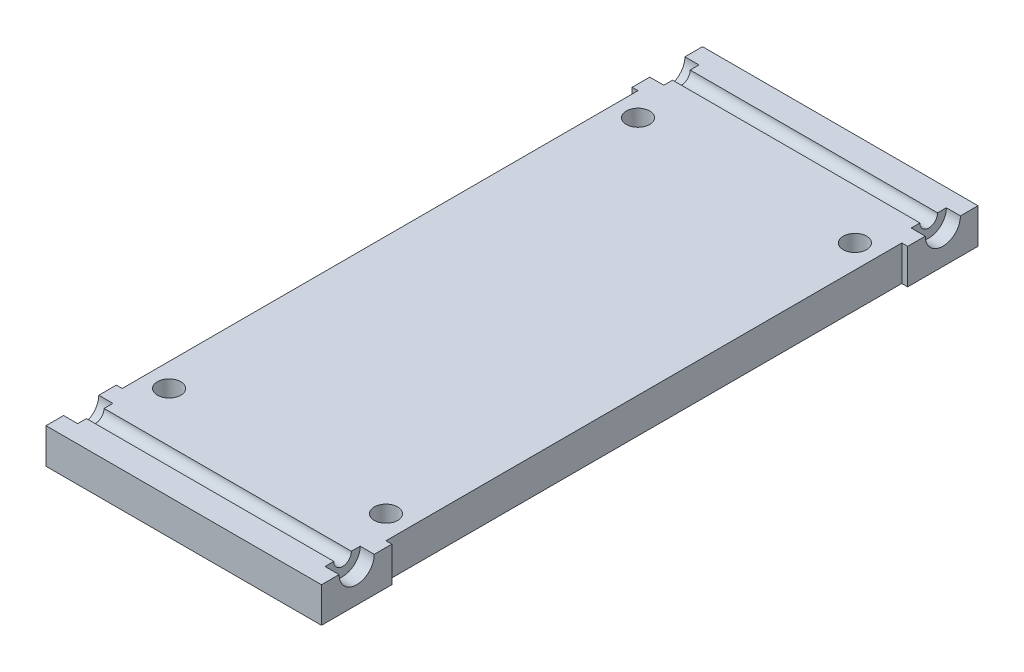
ISO-10303-21;
HEADER;
FILE_DESCRIPTION(('STEP AP214'),'2;1');
FILE_NAME('part.step','',(''),(''),'','','');
FILE_SCHEMA(('AUTOMOTIVE_DESIGN { 1 0 10303 214 1 1 1 1 }'));
ENDSEC;
DATA;
#1=APPLICATION_CONTEXT('core data for automotive mechanical design processes');
#2=APPLICATION_PROTOCOL_DEFINITION('international standard','automotive_design',2000,#1);
#3=PRODUCT_CONTEXT('',#1,'mechanical');
#4=PRODUCT('Part','Part','',(#3));
#5=PRODUCT_RELATED_PRODUCT_CATEGORY('part','',(#4));
#6=PRODUCT_DEFINITION_FORMATION('','',#4);
#7=PRODUCT_DEFINITION_CONTEXT('part definition',#1,'design');
#8=PRODUCT_DEFINITION('design','',#6,#7);
#9=PRODUCT_DEFINITION_SHAPE('','',#8);
#10=(LENGTH_UNIT() NAMED_UNIT(*) SI_UNIT(.MILLI.,.METRE.));
#11=(NAMED_UNIT(*) PLANE_ANGLE_UNIT() SI_UNIT($,.RADIAN.));
#12=(NAMED_UNIT(*) SI_UNIT($,.STERADIAN.) SOLID_ANGLE_UNIT());
#13=UNCERTAINTY_MEASURE_WITH_UNIT(LENGTH_MEASURE(1.E-05),#10,'distance_accuracy_value','');
#14=(GEOMETRIC_REPRESENTATION_CONTEXT(3) GLOBAL_UNCERTAINTY_ASSIGNED_CONTEXT((#13)) GLOBAL_UNIT_ASSIGNED_CONTEXT((#10,
#11,#12)) REPRESENTATION_CONTEXT('',''));
#15=CARTESIAN_POINT('',(0.,0.,0.));
#16=DIRECTION('',(0.,0.,1.));
#17=DIRECTION('',(1.,0.,0.));
#18=AXIS2_PLACEMENT_3D('',#15,#16,#17);
#19=CARTESIAN_POINT('',(0.,3.,0.));
#20=DIRECTION('',(0.,-1.,0.));
#21=DIRECTION('',(0.,0.,-1.));
#22=AXIS2_PLACEMENT_3D('',#19,#20,#21);
#23=PLANE('',#22);
#24=CARTESIAN_POINT('',(-9.25000000000001,3.,-20.));
#25=DIRECTION('',(0.,-1.,0.));
#26=DIRECTION('',(0.,0.,-1.));
#27=AXIS2_PLACEMENT_3D('',#24,#25,#26);
#28=CIRCLE('',#27,1.);
#29=CARTESIAN_POINT('',(-9.25000000000001,3.,-21.));
#30=VERTEX_POINT('',#29);
#31=EDGE_CURVE('E265',#30,#30,#28,.T.);
#32=ORIENTED_EDGE('',*,*,#31,.T.);
#33=EDGE_LOOP('',(#32));
#34=FACE_BOUND('',#33,.T.);
#35=CARTESIAN_POINT('',(9.25000000000001,3.,20.));
#36=DIRECTION('',(0.,-1.,0.));
#37=DIRECTION('',(0.,0.,-1.));
#38=AXIS2_PLACEMENT_3D('',#35,#36,#37);
#39=CIRCLE('',#38,1.);
#40=CARTESIAN_POINT('',(9.25000000000001,3.,19.));
#41=VERTEX_POINT('',#40);
#42=EDGE_CURVE('E251',#41,#41,#39,.T.);
#43=ORIENTED_EDGE('',*,*,#42,.T.);
#44=EDGE_LOOP('',(#43));
#45=FACE_BOUND('',#44,.T.);
#46=CARTESIAN_POINT('',(9.25000000000001,3.,-20.));
#47=DIRECTION('',(0.,-1.,0.));
#48=DIRECTION('',(0.,0.,-1.));
#49=AXIS2_PLACEMENT_3D('',#46,#47,#48);
#50=CIRCLE('',#49,1.);
#51=CARTESIAN_POINT('',(9.25000000000001,3.,-21.));
#52=VERTEX_POINT('',#51);
#53=EDGE_CURVE('E261',#52,#52,#50,.T.);
#54=ORIENTED_EDGE('',*,*,#53,.T.);
#55=EDGE_LOOP('',(#54));
#56=FACE_BOUND('',#55,.T.);
#57=CARTESIAN_POINT('',(-9.25000000000001,3.,20.));
#58=DIRECTION('',(0.,-1.,0.));
#59=DIRECTION('',(0.,0.,-1.));
#60=AXIS2_PLACEMENT_3D('',#57,#58,#59);
#61=CIRCLE('',#60,1.);
#62=CARTESIAN_POINT('',(-9.25000000000001,3.,19.));
#63=VERTEX_POINT('',#62);
#64=EDGE_CURVE('E262',#63,#63,#61,.T.);
#65=ORIENTED_EDGE('',*,*,#64,.T.);
#66=EDGE_LOOP('',(#65));
#67=FACE_BOUND('',#66,.T.);
#68=DIRECTION('',(1.,0.,0.));
#69=VECTOR('',#68,1.);
#70=CARTESIAN_POINT('',(11.25,3.,-22.));
#71=LINE('',#70,#69);
#72=CARTESIAN_POINT('',(11.25,3.,-22.));
#73=VERTEX_POINT('',#72);
#74=CARTESIAN_POINT('',(11.75,3.,-22.));
#75=VERTEX_POINT('',#74);
#76=EDGE_CURVE('E213',#73,#75,#71,.T.);
#77=ORIENTED_EDGE('',*,*,#76,.T.);
#78=DIRECTION('',(0.,0.,-1.));
#79=VECTOR('',#78,1.);
#80=CARTESIAN_POINT('',(11.75,3.,28.));
#81=LINE('',#80,#79);
#82=CARTESIAN_POINT('',(11.75,3.,-23.5));
#83=VERTEX_POINT('',#82);
#84=EDGE_CURVE('E369',#75,#83,#81,.T.);
#85=ORIENTED_EDGE('',*,*,#84,.T.);
#86=DIRECTION('',(1.,0.,0.));
#87=VECTOR('',#86,1.);
#88=CARTESIAN_POINT('',(10.55,3.,-23.5));
#89=LINE('',#88,#87);
#90=CARTESIAN_POINT('',(10.55,3.,-23.5));
#91=VERTEX_POINT('',#90);
#92=EDGE_CURVE('E360',#83,#91,#89,.F.);
#93=ORIENTED_EDGE('',*,*,#92,.T.);
#94=DIRECTION('',(0.,0.,1.));
#95=VECTOR('',#94,1.);
#96=CARTESIAN_POINT('',(10.55,3.,0.));
#97=LINE('',#96,#95);
#98=CARTESIAN_POINT('',(10.55,3.,-24.25));
#99=VERTEX_POINT('',#98);
#100=EDGE_CURVE('E352',#99,#91,#97,.T.);
#101=ORIENTED_EDGE('',*,*,#100,.F.);
#102=DIRECTION('',(1.,0.,0.));
#103=VECTOR('',#102,1.);
#104=CARTESIAN_POINT('',(-11.75,3.,-24.25));
#105=LINE('',#104,#103);
#106=CARTESIAN_POINT('',(-10.55,3.,-24.25));
#107=VERTEX_POINT('',#106);
#108=EDGE_CURVE('E403',#99,#107,#105,.F.);
#109=ORIENTED_EDGE('',*,*,#108,.T.);
#110=DIRECTION('',(0.,0.,1.));
#111=VECTOR('',#110,1.);
#112=CARTESIAN_POINT('',(-10.55,3.,0.));
#113=LINE('',#112,#111);
#114=CARTESIAN_POINT('',(-10.55,3.,-23.5));
#115=VERTEX_POINT('',#114);
#116=EDGE_CURVE('E331',#107,#115,#113,.T.);
#117=ORIENTED_EDGE('',*,*,#116,.T.);
#118=DIRECTION('',(-1.,0.,0.));
#119=VECTOR('',#118,1.);
#120=CARTESIAN_POINT('',(-10.55,3.,-23.5));
#121=LINE('',#120,#119);
#122=CARTESIAN_POINT('',(-11.75,3.,-23.5));
#123=VERTEX_POINT('',#122);
#124=EDGE_CURVE('E326',#123,#115,#121,.F.);
#125=ORIENTED_EDGE('',*,*,#124,.F.);
#126=DIRECTION('',(0.,0.,1.));
#127=VECTOR('',#126,1.);
#128=CARTESIAN_POINT('',(-11.75,3.,28.));
#129=LINE('',#128,#127);
#130=CARTESIAN_POINT('',(-11.75,3.,-22.));
#131=VERTEX_POINT('',#130);
#132=EDGE_CURVE('E376',#123,#131,#129,.T.);
#133=ORIENTED_EDGE('',*,*,#132,.T.);
#134=DIRECTION('',(-1.,0.,0.));
#135=VECTOR('',#134,1.);
#136=CARTESIAN_POINT('',(-11.25,3.,-22.));
#137=LINE('',#136,#135);
#138=CARTESIAN_POINT('',(-11.25,3.,-22.));
#139=VERTEX_POINT('',#138);
#140=EDGE_CURVE('E249',#139,#131,#137,.T.);
#141=ORIENTED_EDGE('',*,*,#140,.F.);
#142=DIRECTION('',(0.,0.,-1.));
#143=VECTOR('',#142,1.);
#144=CARTESIAN_POINT('',(-11.25,3.,-22.));
#145=LINE('',#144,#143);
#146=CARTESIAN_POINT('',(-11.25,3.,22.));
#147=VERTEX_POINT('',#146);
#148=EDGE_CURVE('E244',#147,#139,#145,.T.);
#149=ORIENTED_EDGE('',*,*,#148,.F.);
#150=DIRECTION('',(-1.,0.,0.));
#151=VECTOR('',#150,1.);
#152=CARTESIAN_POINT('',(-11.25,3.,22.));
#153=LINE('',#152,#151);
#154=CARTESIAN_POINT('',(-11.75,3.,22.));
#155=VERTEX_POINT('',#154);
#156=EDGE_CURVE('E252',#147,#155,#153,.T.);
#157=ORIENTED_EDGE('',*,*,#156,.T.);
#158=CARTESIAN_POINT('',(-11.75,3.,23.5));
#159=VERTEX_POINT('',#158);
#160=EDGE_CURVE('E377',#155,#159,#129,.T.);
#161=ORIENTED_EDGE('',*,*,#160,.T.);
#162=DIRECTION('',(-1.,0.,0.));
#163=VECTOR('',#162,1.);
#164=CARTESIAN_POINT('',(-10.55,3.,23.5));
#165=LINE('',#164,#163);
#166=CARTESIAN_POINT('',(-10.55,3.,23.5));
#167=VERTEX_POINT('',#166);
#168=EDGE_CURVE('E321',#167,#159,#165,.T.);
#169=ORIENTED_EDGE('',*,*,#168,.F.);
#170=DIRECTION('',(0.,0.,1.));
#171=VECTOR('',#170,1.);
#172=CARTESIAN_POINT('',(-10.55,3.,0.));
#173=LINE('',#172,#171);
#174=CARTESIAN_POINT('',(-10.55,3.,24.25));
#175=VERTEX_POINT('',#174);
#176=EDGE_CURVE('E318',#167,#175,#173,.T.);
#177=ORIENTED_EDGE('',*,*,#176,.T.);
#178=DIRECTION('',(1.,0.,0.));
#179=VECTOR('',#178,1.);
#180=CARTESIAN_POINT('',(-11.75,3.,24.25));
#181=LINE('',#180,#179);
#182=CARTESIAN_POINT('',(10.55,3.,24.25));
#183=VERTEX_POINT('',#182);
#184=EDGE_CURVE('E411',#175,#183,#181,.T.);
#185=ORIENTED_EDGE('',*,*,#184,.T.);
#186=DIRECTION('',(0.,0.,1.));
#187=VECTOR('',#186,1.);
#188=CARTESIAN_POINT('',(10.55,3.,0.));
#189=LINE('',#188,#187);
#190=CARTESIAN_POINT('',(10.55,3.,23.5));
#191=VERTEX_POINT('',#190);
#192=EDGE_CURVE('E346',#191,#183,#189,.T.);
#193=ORIENTED_EDGE('',*,*,#192,.F.);
#194=DIRECTION('',(1.,0.,0.));
#195=VECTOR('',#194,1.);
#196=CARTESIAN_POINT('',(10.55,3.,23.5));
#197=LINE('',#196,#195);
#198=CARTESIAN_POINT('',(11.75,3.,23.5));
#199=VERTEX_POINT('',#198);
#200=EDGE_CURVE('E354',#191,#199,#197,.T.);
#201=ORIENTED_EDGE('',*,*,#200,.T.);
#202=CARTESIAN_POINT('',(11.75,3.,22.));
#203=VERTEX_POINT('',#202);
#204=EDGE_CURVE('E368',#199,#203,#81,.T.);
#205=ORIENTED_EDGE('',*,*,#204,.T.);
#206=DIRECTION('',(1.,0.,0.));
#207=VECTOR('',#206,1.);
#208=CARTESIAN_POINT('',(11.25,3.,22.));
#209=LINE('',#208,#207);
#210=CARTESIAN_POINT('',(11.25,3.,22.));
#211=VERTEX_POINT('',#210);
#212=EDGE_CURVE('E223',#211,#203,#209,.T.);
#213=ORIENTED_EDGE('',*,*,#212,.F.);
#214=DIRECTION('',(0.,0.,-1.));
#215=VECTOR('',#214,1.);
#216=CARTESIAN_POINT('',(11.25,3.,28.));
#217=LINE('',#216,#215);
#218=EDGE_CURVE('E205',#211,#73,#217,.T.);
#219=ORIENTED_EDGE('',*,*,#218,.T.);
#220=EDGE_LOOP('',(#77,#85,#93,#101,#109,#117,#125,#133,#141,#149,#157,#161,#169,#177,#185,#193,
#201,#205,#213,#219));
#221=FACE_BOUND('',#220,.T.);
#222=ADVANCED_FACE('F41',(#34,#45,#56,#67,#221),#23,.F.);
#223=CARTESIAN_POINT('',(11.75,3.,28.));
#224=DIRECTION('',(-1.,0.,0.));
#225=DIRECTION('',(0.,0.,1.));
#226=AXIS2_PLACEMENT_3D('',#223,#224,#225);
#227=PLANE('',#226);
#228=DIRECTION('',(0.,-1.,0.));
#229=VECTOR('',#228,1.);
#230=CARTESIAN_POINT('',(11.75,3.,-22.));
#231=LINE('',#230,#229);
#232=CARTESIAN_POINT('',(11.75,0.,-22.));
#233=VERTEX_POINT('',#232);
#234=EDGE_CURVE('E216',#75,#233,#231,.T.);
#235=ORIENTED_EDGE('',*,*,#234,.T.);
#236=DIRECTION('',(0.,0.,-1.));
#237=VECTOR('',#236,1.);
#238=CARTESIAN_POINT('',(11.75,0.,28.));
#239=LINE('',#238,#237);
#240=CARTESIAN_POINT('',(11.75,0.,-28.));
#241=VERTEX_POINT('',#240);
#242=EDGE_CURVE('E363',#233,#241,#239,.T.);
#243=ORIENTED_EDGE('',*,*,#242,.T.);
#244=DIRECTION('',(0.,-1.,0.));
#245=VECTOR('',#244,1.);
#246=CARTESIAN_POINT('',(11.75,3.,-28.));
#247=LINE('',#246,#245);
#248=CARTESIAN_POINT('',(11.75,3.,-28.));
#249=VERTEX_POINT('',#248);
#250=EDGE_CURVE('E400',#249,#241,#247,.T.);
#251=ORIENTED_EDGE('',*,*,#250,.F.);
#252=CARTESIAN_POINT('',(11.75,3.,-26.5));
#253=VERTEX_POINT('',#252);
#254=EDGE_CURVE('E391',#253,#249,#81,.T.);
#255=ORIENTED_EDGE('',*,*,#254,.F.);
#256=CARTESIAN_POINT('',(11.75,3.,-25.));
#257=DIRECTION('',(1.,0.,0.));
#258=DIRECTION('',(0.,0.,-1.));
#259=AXIS2_PLACEMENT_3D('',#256,#257,#258);
#260=CIRCLE('',#259,1.5);
#261=EDGE_CURVE('E339',#83,#253,#260,.T.);
#262=ORIENTED_EDGE('',*,*,#261,.F.);
#263=ORIENTED_EDGE('',*,*,#84,.F.);
#264=EDGE_LOOP('',(#235,#243,#251,#255,#262,#263));
#265=FACE_BOUND('',#264,.T.);
#266=ADVANCED_FACE('F43',(#265),#227,.F.);
#267=DIRECTION('',(0.,1.,0.));
#268=VECTOR('',#267,1.);
#269=CARTESIAN_POINT('',(11.75,3.,22.));
#270=LINE('',#269,#268);
#271=CARTESIAN_POINT('',(11.75,0.,22.));
#272=VERTEX_POINT('',#271);
#273=EDGE_CURVE('E224',#272,#203,#270,.T.);
#274=ORIENTED_EDGE('',*,*,#273,.T.);
#275=ORIENTED_EDGE('',*,*,#204,.F.);
#276=CARTESIAN_POINT('',(11.75,3.,25.));
#277=DIRECTION('',(1.,0.,0.));
#278=DIRECTION('',(0.,0.,-1.));
#279=AXIS2_PLACEMENT_3D('',#276,#277,#278);
#280=CIRCLE('',#279,1.5);
#281=CARTESIAN_POINT('',(11.75,3.,26.5));
#282=VERTEX_POINT('',#281);
#283=EDGE_CURVE('E341',#282,#199,#280,.T.);
#284=ORIENTED_EDGE('',*,*,#283,.F.);
#285=CARTESIAN_POINT('',(11.75,3.,28.));
#286=VERTEX_POINT('',#285);
#287=EDGE_CURVE('E364',#286,#282,#81,.T.);
#288=ORIENTED_EDGE('',*,*,#287,.F.);
#289=DIRECTION('',(0.,-1.,0.));
#290=VECTOR('',#289,1.);
#291=CARTESIAN_POINT('',(11.75,3.,28.));
#292=LINE('',#291,#290);
#293=CARTESIAN_POINT('',(11.75,0.,28.));
#294=VERTEX_POINT('',#293);
#295=EDGE_CURVE('E379',#286,#294,#292,.T.);
#296=ORIENTED_EDGE('',*,*,#295,.T.);
#297=EDGE_CURVE('E380',#294,#272,#239,.T.);
#298=ORIENTED_EDGE('',*,*,#297,.T.);
#299=EDGE_LOOP('',(#274,#275,#284,#288,#296,#298));
#300=FACE_BOUND('',#299,.T.);
#301=ADVANCED_FACE('F457',(#300),#227,.F.);
#302=CARTESIAN_POINT('',(0.,0.,0.));
#303=DIRECTION('',(0.,-1.,0.));
#304=DIRECTION('',(0.,0.,-1.));
#305=AXIS2_PLACEMENT_3D('',#302,#303,#304);
#306=PLANE('',#305);
#307=CARTESIAN_POINT('',(9.25000000000001,0.,-20.));
#308=DIRECTION('',(0.,-1.,0.));
#309=DIRECTION('',(0.,0.,-1.));
#310=AXIS2_PLACEMENT_3D('',#307,#308,#309);
#311=CIRCLE('',#310,1.5);
#312=CARTESIAN_POINT('',(9.25000000000001,0.,-21.5));
#313=VERTEX_POINT('',#312);
#314=EDGE_CURVE('E289',#313,#313,#311,.T.);
#315=ORIENTED_EDGE('',*,*,#314,.F.);
#316=EDGE_LOOP('',(#315));
#317=FACE_BOUND('',#316,.T.);
#318=CARTESIAN_POINT('',(-9.25000000000001,0.,20.));
#319=DIRECTION('',(0.,-1.,0.));
#320=DIRECTION('',(0.,0.,-1.));
#321=AXIS2_PLACEMENT_3D('',#318,#319,#320);
#322=CIRCLE('',#321,1.5);
#323=CARTESIAN_POINT('',(-9.25000000000001,0.,18.5));
#324=VERTEX_POINT('',#323);
#325=EDGE_CURVE('E296',#324,#324,#322,.T.);
#326=ORIENTED_EDGE('',*,*,#325,.F.);
#327=EDGE_LOOP('',(#326));
#328=FACE_BOUND('',#327,.T.);
#329=CARTESIAN_POINT('',(9.25000000000001,0.,20.));
#330=DIRECTION('',(0.,-1.,0.));
#331=DIRECTION('',(0.,0.,-1.));
#332=AXIS2_PLACEMENT_3D('',#329,#330,#331);
#333=CIRCLE('',#332,1.5);
#334=CARTESIAN_POINT('',(9.25000000000001,0.,18.5));
#335=VERTEX_POINT('',#334);
#336=EDGE_CURVE('E283',#335,#335,#333,.T.);
#337=ORIENTED_EDGE('',*,*,#336,.F.);
#338=EDGE_LOOP('',(#337));
#339=FACE_BOUND('',#338,.T.);
#340=CARTESIAN_POINT('',(-9.25000000000001,0.,-20.));
#341=DIRECTION('',(0.,-1.,0.));
#342=DIRECTION('',(0.,0.,-1.));
#343=AXIS2_PLACEMENT_3D('',#340,#341,#342);
#344=CIRCLE('',#343,1.5);
#345=CARTESIAN_POINT('',(-9.25000000000001,0.,-21.5));
#346=VERTEX_POINT('',#345);
#347=EDGE_CURVE('E292',#346,#346,#344,.T.);
#348=ORIENTED_EDGE('',*,*,#347,.F.);
#349=EDGE_LOOP('',(#348));
#350=FACE_BOUND('',#349,.T.);
#351=ORIENTED_EDGE('',*,*,#242,.F.);
#352=DIRECTION('',(1.,0.,0.));
#353=VECTOR('',#352,1.);
#354=CARTESIAN_POINT('',(11.25,0.,-22.));
#355=LINE('',#354,#353);
#356=CARTESIAN_POINT('',(11.25,0.,-22.));
#357=VERTEX_POINT('',#356);
#358=EDGE_CURVE('E220',#357,#233,#355,.T.);
#359=ORIENTED_EDGE('',*,*,#358,.F.);
#360=DIRECTION('',(0.,0.,1.));
#361=VECTOR('',#360,1.);
#362=CARTESIAN_POINT('',(11.25,0.,28.));
#363=LINE('',#362,#361);
#364=CARTESIAN_POINT('',(11.25,0.,22.));
#365=VERTEX_POINT('',#364);
#366=EDGE_CURVE('E208',#357,#365,#363,.T.);
#367=ORIENTED_EDGE('',*,*,#366,.T.);
#368=DIRECTION('',(1.,0.,0.));
#369=VECTOR('',#368,1.);
#370=CARTESIAN_POINT('',(11.25,0.,22.));
#371=LINE('',#370,#369);
#372=EDGE_CURVE('E233',#365,#272,#371,.T.);
#373=ORIENTED_EDGE('',*,*,#372,.T.);
#374=ORIENTED_EDGE('',*,*,#297,.F.);
#375=DIRECTION('',(1.,0.,0.));
#376=VECTOR('',#375,1.);
#377=CARTESIAN_POINT('',(-11.75,0.,28.));
#378=LINE('',#377,#376);
#379=CARTESIAN_POINT('',(-11.75,0.,28.));
#380=VERTEX_POINT('',#379);
#381=EDGE_CURVE('E389',#380,#294,#378,.T.);
#382=ORIENTED_EDGE('',*,*,#381,.F.);
#383=DIRECTION('',(0.,0.,1.));
#384=VECTOR('',#383,1.);
#385=CARTESIAN_POINT('',(-11.75,0.,28.));
#386=LINE('',#385,#384);
#387=CARTESIAN_POINT('',(-11.75,0.,22.));
#388=VERTEX_POINT('',#387);
#389=EDGE_CURVE('E385',#388,#380,#386,.T.);
#390=ORIENTED_EDGE('',*,*,#389,.F.);
#391=DIRECTION('',(-1.,0.,0.));
#392=VECTOR('',#391,1.);
#393=CARTESIAN_POINT('',(-11.25,0.,22.));
#394=LINE('',#393,#392);
#395=CARTESIAN_POINT('',(-11.25,0.,22.));
#396=VERTEX_POINT('',#395);
#397=EDGE_CURVE('E255',#396,#388,#394,.T.);
#398=ORIENTED_EDGE('',*,*,#397,.F.);
#399=DIRECTION('',(0.,0.,1.));
#400=VECTOR('',#399,1.);
#401=CARTESIAN_POINT('',(-11.25,0.,-22.));
#402=LINE('',#401,#400);
#403=CARTESIAN_POINT('',(-11.25,0.,-22.));
#404=VERTEX_POINT('',#403);
#405=EDGE_CURVE('E238',#404,#396,#402,.T.);
#406=ORIENTED_EDGE('',*,*,#405,.F.);
#407=DIRECTION('',(-1.,0.,0.));
#408=VECTOR('',#407,1.);
#409=CARTESIAN_POINT('',(-11.25,0.,-22.));
#410=LINE('',#409,#408);
#411=CARTESIAN_POINT('',(-11.75,0.,-22.));
#412=VERTEX_POINT('',#411);
#413=EDGE_CURVE('E246',#404,#412,#410,.T.);
#414=ORIENTED_EDGE('',*,*,#413,.T.);
#415=CARTESIAN_POINT('',(-11.75,0.,-28.));
#416=VERTEX_POINT('',#415);
#417=EDGE_CURVE('E386',#416,#412,#386,.T.);
#418=ORIENTED_EDGE('',*,*,#417,.F.);
#419=DIRECTION('',(-1.,0.,0.));
#420=VECTOR('',#419,1.);
#421=CARTESIAN_POINT('',(-11.75,0.,-28.));
#422=LINE('',#421,#420);
#423=EDGE_CURVE('E383',#241,#416,#422,.T.);
#424=ORIENTED_EDGE('',*,*,#423,.F.);
#425=EDGE_LOOP('',(#351,#359,#367,#373,#374,#382,#390,#398,#406,#414,#418,#424));
#426=FACE_BOUND('',#425,.T.);
#427=ADVANCED_FACE('F484',(#317,#328,#339,#350,#426),#306,.T.);
#428=CARTESIAN_POINT('',(-11.75,3.,28.));
#429=DIRECTION('',(1.,0.,0.));
#430=DIRECTION('',(0.,0.,-1.));
#431=AXIS2_PLACEMENT_3D('',#428,#429,#430);
#432=PLANE('',#431);
#433=ORIENTED_EDGE('',*,*,#417,.T.);
#434=DIRECTION('',(0.,-1.,0.));
#435=VECTOR('',#434,1.);
#436=CARTESIAN_POINT('',(-11.75,3.,-22.));
#437=LINE('',#436,#435);
#438=EDGE_CURVE('E219',#131,#412,#437,.T.);
#439=ORIENTED_EDGE('',*,*,#438,.F.);
#440=ORIENTED_EDGE('',*,*,#132,.F.);
#441=CARTESIAN_POINT('',(-11.75,3.,-25.));
#442=DIRECTION('',(1.,0.,0.));
#443=DIRECTION('',(0.,0.,-1.));
#444=AXIS2_PLACEMENT_3D('',#441,#442,#443);
#445=CIRCLE('',#444,1.5);
#446=CARTESIAN_POINT('',(-11.75,3.,-26.5));
#447=VERTEX_POINT('',#446);
#448=EDGE_CURVE('E49',#447,#123,#445,.F.);
#449=ORIENTED_EDGE('',*,*,#448,.F.);
#450=CARTESIAN_POINT('',(-11.75,3.,-28.));
#451=VERTEX_POINT('',#450);
#452=EDGE_CURVE('E372',#451,#447,#129,.T.);
#453=ORIENTED_EDGE('',*,*,#452,.F.);
#454=DIRECTION('',(0.,-1.,0.));
#455=VECTOR('',#454,1.);
#456=CARTESIAN_POINT('',(-11.75,3.,-28.));
#457=LINE('',#456,#455);
#458=EDGE_CURVE('E397',#451,#416,#457,.T.);
#459=ORIENTED_EDGE('',*,*,#458,.T.);
#460=EDGE_LOOP('',(#433,#439,#440,#449,#453,#459));
#461=FACE_BOUND('',#460,.T.);
#462=ADVANCED_FACE('F437',(#461),#432,.F.);
#463=DIRECTION('',(-1.,0.,0.));
#464=VECTOR('',#463,1.);
#465=CARTESIAN_POINT('',(-10.55,3.,-26.5));
#466=LINE('',#465,#464);
#467=CARTESIAN_POINT('',(-10.55,3.,-26.5));
#468=VERTEX_POINT('',#467);
#469=EDGE_CURVE('E324',#468,#447,#466,.T.);
#470=ORIENTED_EDGE('',*,*,#469,.F.);
#471=DIRECTION('',(0.,0.,1.));
#472=VECTOR('',#471,1.);
#473=CARTESIAN_POINT('',(-10.55,3.,0.));
#474=LINE('',#473,#472);
#475=CARTESIAN_POINT('',(-10.55,3.,-25.75));
#476=VERTEX_POINT('',#475);
#477=EDGE_CURVE('E12',#468,#476,#474,.T.);
#478=ORIENTED_EDGE('',*,*,#477,.T.);
#479=DIRECTION('',(1.,0.,0.));
#480=VECTOR('',#479,1.);
#481=CARTESIAN_POINT('',(-11.75,3.,-25.75));
#482=LINE('',#481,#480);
#483=CARTESIAN_POINT('',(10.55,3.,-25.75));
#484=VERTEX_POINT('',#483);
#485=EDGE_CURVE('E406',#476,#484,#482,.T.);
#486=ORIENTED_EDGE('',*,*,#485,.T.);
#487=DIRECTION('',(0.,0.,1.));
#488=VECTOR('',#487,1.);
#489=CARTESIAN_POINT('',(10.55,3.,0.));
#490=LINE('',#489,#488);
#491=CARTESIAN_POINT('',(10.55,3.,-26.5));
#492=VERTEX_POINT('',#491);
#493=EDGE_CURVE('E349',#492,#484,#490,.T.);
#494=ORIENTED_EDGE('',*,*,#493,.F.);
#495=DIRECTION('',(1.,0.,0.));
#496=VECTOR('',#495,1.);
#497=CARTESIAN_POINT('',(10.55,3.,-26.5));
#498=LINE('',#497,#496);
#499=EDGE_CURVE('E357',#492,#253,#498,.T.);
#500=ORIENTED_EDGE('',*,*,#499,.T.);
#501=ORIENTED_EDGE('',*,*,#254,.T.);
#502=DIRECTION('',(-1.,0.,0.));
#503=VECTOR('',#502,1.);
#504=CARTESIAN_POINT('',(-11.75,3.,-28.));
#505=LINE('',#504,#503);
#506=EDGE_CURVE('E367',#249,#451,#505,.T.);
#507=ORIENTED_EDGE('',*,*,#506,.T.);
#508=ORIENTED_EDGE('',*,*,#452,.T.);
#509=EDGE_LOOP('',(#470,#478,#486,#494,#500,#501,#507,#508));
#510=FACE_BOUND('',#509,.T.);
#511=ADVANCED_FACE('F489',(#510),#23,.F.);
#512=DIRECTION('',(-1.,0.,0.));
#513=VECTOR('',#512,1.);
#514=CARTESIAN_POINT('',(-10.55,3.,26.5));
#515=LINE('',#514,#513);
#516=CARTESIAN_POINT('',(-11.75,3.,26.5));
#517=VERTEX_POINT('',#516);
#518=CARTESIAN_POINT('',(-10.55,3.,26.5));
#519=VERTEX_POINT('',#518);
#520=EDGE_CURVE('E423',#517,#519,#515,.F.);
#521=ORIENTED_EDGE('',*,*,#520,.F.);
#522=CARTESIAN_POINT('',(-11.75,3.,28.));
#523=VERTEX_POINT('',#522);
#524=EDGE_CURVE('E371',#517,#523,#129,.T.);
#525=ORIENTED_EDGE('',*,*,#524,.T.);
#526=DIRECTION('',(1.,0.,0.));
#527=VECTOR('',#526,1.);
#528=CARTESIAN_POINT('',(-11.75,3.,28.));
#529=LINE('',#528,#527);
#530=EDGE_CURVE('E375',#523,#286,#529,.T.);
#531=ORIENTED_EDGE('',*,*,#530,.T.);
#532=ORIENTED_EDGE('',*,*,#287,.T.);
#533=DIRECTION('',(1.,0.,0.));
#534=VECTOR('',#533,1.);
#535=CARTESIAN_POINT('',(10.55,3.,26.5));
#536=LINE('',#535,#534);
#537=CARTESIAN_POINT('',(10.55,3.,26.5));
#538=VERTEX_POINT('',#537);
#539=EDGE_CURVE('E417',#282,#538,#536,.F.);
#540=ORIENTED_EDGE('',*,*,#539,.T.);
#541=DIRECTION('',(0.,0.,1.));
#542=VECTOR('',#541,1.);
#543=CARTESIAN_POINT('',(10.55,3.,0.));
#544=LINE('',#543,#542);
#545=CARTESIAN_POINT('',(10.55,3.,25.75));
#546=VERTEX_POINT('',#545);
#547=EDGE_CURVE('E338',#546,#538,#544,.T.);
#548=ORIENTED_EDGE('',*,*,#547,.F.);
#549=DIRECTION('',(1.,0.,0.));
#550=VECTOR('',#549,1.);
#551=CARTESIAN_POINT('',(-11.75,3.,25.75));
#552=LINE('',#551,#550);
#553=CARTESIAN_POINT('',(-10.55,3.,25.75));
#554=VERTEX_POINT('',#553);
#555=EDGE_CURVE('E408',#546,#554,#552,.F.);
#556=ORIENTED_EDGE('',*,*,#555,.T.);
#557=DIRECTION('',(0.,0.,1.));
#558=VECTOR('',#557,1.);
#559=CARTESIAN_POINT('',(-10.55,3.,0.));
#560=LINE('',#559,#558);
#561=EDGE_CURVE('E420',#554,#519,#560,.T.);
#562=ORIENTED_EDGE('',*,*,#561,.T.);
#563=EDGE_LOOP('',(#521,#525,#531,#532,#540,#548,#556,#562));
#564=FACE_BOUND('',#563,.T.);
#565=ADVANCED_FACE('F442',(#564),#23,.F.);
#566=CARTESIAN_POINT('',(-11.75,3.,-25.));
#567=DIRECTION('',(1.,0.,0.));
#568=DIRECTION('',(0.,0.,-1.));
#569=AXIS2_PLACEMENT_3D('',#566,#567,#568);
#570=CYLINDRICAL_SURFACE('',#569,0.750000000000002);
#571=ORIENTED_EDGE('',*,*,#485,.F.);
#572=CARTESIAN_POINT('',(-10.55,3.,-25.));
#573=DIRECTION('',(1.,0.,0.));
#574=DIRECTION('',(0.,0.,-1.));
#575=AXIS2_PLACEMENT_3D('',#572,#573,#574);
#576=CIRCLE('',#575,0.750000000000002);
#577=EDGE_CURVE('E328',#476,#107,#576,.F.);
#578=ORIENTED_EDGE('',*,*,#577,.T.);
#579=ORIENTED_EDGE('',*,*,#108,.F.);
#580=CARTESIAN_POINT('',(10.55,3.,-25.));
#581=DIRECTION('',(1.,0.,0.));
#582=DIRECTION('',(0.,0.,-1.));
#583=AXIS2_PLACEMENT_3D('',#580,#581,#582);
#584=CIRCLE('',#583,0.750000000000002);
#585=EDGE_CURVE('E415',#484,#99,#584,.F.);
#586=ORIENTED_EDGE('',*,*,#585,.F.);
#587=EDGE_LOOP('',(#571,#578,#579,#586));
#588=FACE_BOUND('',#587,.T.);
#589=ADVANCED_FACE('F503',(#588),#570,.F.);
#590=CARTESIAN_POINT('',(-11.75,3.,25.));
#591=DIRECTION('',(1.,0.,0.));
#592=DIRECTION('',(0.,0.,-1.));
#593=AXIS2_PLACEMENT_3D('',#590,#591,#592);
#594=CYLINDRICAL_SURFACE('',#593,0.750000000000002);
#595=ORIENTED_EDGE('',*,*,#184,.F.);
#596=CARTESIAN_POINT('',(-10.55,3.,25.));
#597=DIRECTION('',(1.,0.,0.));
#598=DIRECTION('',(0.,0.,-1.));
#599=AXIS2_PLACEMENT_3D('',#596,#597,#598);
#600=CIRCLE('',#599,0.750000000000002);
#601=EDGE_CURVE('E310',#175,#554,#600,.F.);
#602=ORIENTED_EDGE('',*,*,#601,.T.);
#603=ORIENTED_EDGE('',*,*,#555,.F.);
#604=CARTESIAN_POINT('',(10.55,3.,25.));
#605=DIRECTION('',(1.,0.,0.));
#606=DIRECTION('',(0.,0.,-1.));
#607=AXIS2_PLACEMENT_3D('',#604,#605,#606);
#608=CIRCLE('',#607,0.750000000000002);
#609=EDGE_CURVE('E413',#183,#546,#608,.F.);
#610=ORIENTED_EDGE('',*,*,#609,.F.);
#611=EDGE_LOOP('',(#595,#602,#603,#610));
#612=FACE_BOUND('',#611,.T.);
#613=ADVANCED_FACE('F471',(#612),#594,.F.);
#614=CARTESIAN_POINT('',(-11.75,3.,-28.));
#615=DIRECTION('',(0.,0.,1.));
#616=DIRECTION('',(1.,0.,0.));
#617=AXIS2_PLACEMENT_3D('',#614,#615,#616);
#618=PLANE('',#617);
#619=ORIENTED_EDGE('',*,*,#423,.T.);
#620=ORIENTED_EDGE('',*,*,#458,.F.);
#621=ORIENTED_EDGE('',*,*,#506,.F.);
#622=ORIENTED_EDGE('',*,*,#250,.T.);
#623=EDGE_LOOP('',(#619,#620,#621,#622));
#624=FACE_BOUND('',#623,.T.);
#625=ADVANCED_FACE('F496',(#624),#618,.F.);
#626=ORIENTED_EDGE('',*,*,#160,.F.);
#627=DIRECTION('',(0.,1.,0.));
#628=VECTOR('',#627,1.);
#629=CARTESIAN_POINT('',(-11.75,3.,22.));
#630=LINE('',#629,#628);
#631=EDGE_CURVE('E239',#388,#155,#630,.T.);
#632=ORIENTED_EDGE('',*,*,#631,.F.);
#633=ORIENTED_EDGE('',*,*,#389,.T.);
#634=DIRECTION('',(0.,-1.,0.));
#635=VECTOR('',#634,1.);
#636=CARTESIAN_POINT('',(-11.75,3.,28.));
#637=LINE('',#636,#635);
#638=EDGE_CURVE('E394',#523,#380,#637,.T.);
#639=ORIENTED_EDGE('',*,*,#638,.F.);
#640=ORIENTED_EDGE('',*,*,#524,.F.);
#641=CARTESIAN_POINT('',(-11.75,3.,25.));
#642=DIRECTION('',(1.,0.,0.));
#643=DIRECTION('',(0.,0.,-1.));
#644=AXIS2_PLACEMENT_3D('',#641,#642,#643);
#645=CIRCLE('',#644,1.5);
#646=EDGE_CURVE('E311',#517,#159,#645,.T.);
#647=ORIENTED_EDGE('',*,*,#646,.T.);
#648=EDGE_LOOP('',(#626,#632,#633,#639,#640,#647));
#649=FACE_BOUND('',#648,.T.);
#650=ADVANCED_FACE('F447',(#649),#432,.F.);
#651=CARTESIAN_POINT('',(-11.75,3.,28.));
#652=DIRECTION('',(0.,0.,-1.));
#653=DIRECTION('',(-1.,0.,0.));
#654=AXIS2_PLACEMENT_3D('',#651,#652,#653);
#655=PLANE('',#654);
#656=ORIENTED_EDGE('',*,*,#381,.T.);
#657=ORIENTED_EDGE('',*,*,#295,.F.);
#658=ORIENTED_EDGE('',*,*,#530,.F.);
#659=ORIENTED_EDGE('',*,*,#638,.T.);
#660=EDGE_LOOP('',(#656,#657,#658,#659));
#661=FACE_BOUND('',#660,.T.);
#662=ADVANCED_FACE('F452',(#661),#655,.F.);
#663=CARTESIAN_POINT('',(10.55,3.,25.));
#664=DIRECTION('',(1.,0.,0.));
#665=DIRECTION('',(0.,0.,-1.));
#666=AXIS2_PLACEMENT_3D('',#663,#664,#665);
#667=CYLINDRICAL_SURFACE('',#666,1.5);
#668=CARTESIAN_POINT('',(10.55,3.,25.));
#669=DIRECTION('',(1.,0.,0.));
#670=DIRECTION('',(0.,0.,-1.));
#671=AXIS2_PLACEMENT_3D('',#668,#669,#670);
#672=CIRCLE('',#671,1.5);
#673=EDGE_CURVE('E334',#538,#191,#672,.T.);
#674=ORIENTED_EDGE('',*,*,#673,.F.);
#675=ORIENTED_EDGE('',*,*,#539,.F.);
#676=ORIENTED_EDGE('',*,*,#283,.T.);
#677=ORIENTED_EDGE('',*,*,#200,.F.);
#678=EDGE_LOOP('',(#674,#675,#676,#677));
#679=FACE_BOUND('',#678,.T.);
#680=ADVANCED_FACE('F463',(#679),#667,.F.);
#681=CARTESIAN_POINT('',(10.55,3.,25.));
#682=DIRECTION('',(1.,0.,0.));
#683=DIRECTION('',(0.,0.,-1.));
#684=AXIS2_PLACEMENT_3D('',#681,#682,#683);
#685=PLANE('',#684);
#686=ORIENTED_EDGE('',*,*,#192,.T.);
#687=ORIENTED_EDGE('',*,*,#609,.T.);
#688=ORIENTED_EDGE('',*,*,#547,.T.);
#689=ORIENTED_EDGE('',*,*,#673,.T.);
#690=EDGE_LOOP('',(#686,#687,#688,#689));
#691=FACE_BOUND('',#690,.T.);
#692=ADVANCED_FACE('F466',(#691),#685,.T.);
#693=CARTESIAN_POINT('',(10.55,3.,-25.));
#694=DIRECTION('',(1.,0.,0.));
#695=DIRECTION('',(0.,0.,-1.));
#696=AXIS2_PLACEMENT_3D('',#693,#694,#695);
#697=CYLINDRICAL_SURFACE('',#696,1.5);
#698=ORIENTED_EDGE('',*,*,#261,.T.);
#699=ORIENTED_EDGE('',*,*,#499,.F.);
#700=CARTESIAN_POINT('',(10.55,3.,-25.));
#701=DIRECTION('',(1.,0.,0.));
#702=DIRECTION('',(0.,0.,-1.));
#703=AXIS2_PLACEMENT_3D('',#700,#701,#702);
#704=CIRCLE('',#703,1.5);
#705=EDGE_CURVE('E335',#91,#492,#704,.T.);
#706=ORIENTED_EDGE('',*,*,#705,.F.);
#707=ORIENTED_EDGE('',*,*,#92,.F.);
#708=EDGE_LOOP('',(#698,#699,#706,#707));
#709=FACE_BOUND('',#708,.T.);
#710=ADVANCED_FACE('F511',(#709),#697,.F.);
#711=CARTESIAN_POINT('',(10.55,3.,-25.));
#712=DIRECTION('',(1.,0.,0.));
#713=DIRECTION('',(0.,0.,-1.));
#714=AXIS2_PLACEMENT_3D('',#711,#712,#713);
#715=PLANE('',#714);
#716=ORIENTED_EDGE('',*,*,#100,.T.);
#717=ORIENTED_EDGE('',*,*,#705,.T.);
#718=ORIENTED_EDGE('',*,*,#493,.T.);
#719=ORIENTED_EDGE('',*,*,#585,.T.);
#720=EDGE_LOOP('',(#716,#717,#718,#719));
#721=FACE_BOUND('',#720,.T.);
#722=ADVANCED_FACE('F507',(#721),#715,.T.);
#723=CARTESIAN_POINT('',(-10.55,3.,25.));
#724=DIRECTION('',(-1.,0.,0.));
#725=DIRECTION('',(0.,0.,1.));
#726=AXIS2_PLACEMENT_3D('',#723,#724,#725);
#727=CYLINDRICAL_SURFACE('',#726,1.5);
#728=ORIENTED_EDGE('',*,*,#168,.T.);
#729=ORIENTED_EDGE('',*,*,#646,.F.);
#730=ORIENTED_EDGE('',*,*,#520,.T.);
#731=CARTESIAN_POINT('',(-10.55,3.,25.));
#732=DIRECTION('',(1.,0.,0.));
#733=DIRECTION('',(0.,0.,-1.));
#734=AXIS2_PLACEMENT_3D('',#731,#732,#733);
#735=CIRCLE('',#734,1.5);
#736=EDGE_CURVE('E307',#519,#167,#735,.T.);
#737=ORIENTED_EDGE('',*,*,#736,.T.);
#738=EDGE_LOOP('',(#728,#729,#730,#737));
#739=FACE_BOUND('',#738,.T.);
#740=ADVANCED_FACE('F475',(#739),#727,.F.);
#741=CARTESIAN_POINT('',(-10.55,3.,25.));
#742=DIRECTION('',(1.,0.,0.));
#743=DIRECTION('',(0.,0.,-1.));
#744=AXIS2_PLACEMENT_3D('',#741,#742,#743);
#745=PLANE('',#744);
#746=ORIENTED_EDGE('',*,*,#736,.F.);
#747=ORIENTED_EDGE('',*,*,#561,.F.);
#748=ORIENTED_EDGE('',*,*,#601,.F.);
#749=ORIENTED_EDGE('',*,*,#176,.F.);
#750=EDGE_LOOP('',(#746,#747,#748,#749));
#751=FACE_BOUND('',#750,.T.);
#752=ADVANCED_FACE('F473',(#751),#745,.F.);
#753=CARTESIAN_POINT('',(-10.55,3.,-25.));
#754=DIRECTION('',(1.,0.,0.));
#755=DIRECTION('',(0.,0.,-1.));
#756=AXIS2_PLACEMENT_3D('',#753,#754,#755);
#757=PLANE('',#756);
#758=ORIENTED_EDGE('',*,*,#577,.F.);
#759=ORIENTED_EDGE('',*,*,#477,.F.);
#760=CARTESIAN_POINT('',(-10.55,3.,-25.));
#761=DIRECTION('',(1.,0.,0.));
#762=DIRECTION('',(0.,0.,-1.));
#763=AXIS2_PLACEMENT_3D('',#760,#761,#762);
#764=CIRCLE('',#763,1.5);
#765=EDGE_CURVE('E304',#115,#468,#764,.T.);
#766=ORIENTED_EDGE('',*,*,#765,.F.);
#767=ORIENTED_EDGE('',*,*,#116,.F.);
#768=EDGE_LOOP('',(#758,#759,#766,#767));
#769=FACE_BOUND('',#768,.T.);
#770=ADVANCED_FACE('F789',(#769),#757,.F.);
#771=CARTESIAN_POINT('',(-10.55,3.,-25.));
#772=DIRECTION('',(-1.,0.,0.));
#773=DIRECTION('',(0.,0.,1.));
#774=AXIS2_PLACEMENT_3D('',#771,#772,#773);
#775=CYLINDRICAL_SURFACE('',#774,1.5);
#776=ORIENTED_EDGE('',*,*,#124,.T.);
#777=ORIENTED_EDGE('',*,*,#765,.T.);
#778=ORIENTED_EDGE('',*,*,#469,.T.);
#779=ORIENTED_EDGE('',*,*,#448,.T.);
#780=EDGE_LOOP('',(#776,#777,#778,#779));
#781=FACE_BOUND('',#780,.T.);
#782=ADVANCED_FACE('F428',(#781),#775,.F.);
#783=CARTESIAN_POINT('',(-9.25000000000001,7.24264068711929,-20.));
#784=DIRECTION('',(0.,-1.,0.));
#785=DIRECTION('',(0.,0.,-1.));
#786=AXIS2_PLACEMENT_3D('',#783,#784,#785);
#787=CYLINDRICAL_SURFACE('',#786,1.5);
#788=CARTESIAN_POINT('',(-9.25000000000001,1.,-20.));
#789=DIRECTION('',(0.,-1.,0.));
#790=DIRECTION('',(0.,0.,-1.));
#791=AXIS2_PLACEMENT_3D('',#788,#789,#790);
#792=CIRCLE('',#791,1.5);
#793=CARTESIAN_POINT('',(-9.25000000000001,1.,-21.5));
#794=VERTEX_POINT('',#793);
#795=EDGE_CURVE('E301',#794,#794,#792,.F.);
#796=ORIENTED_EDGE('',*,*,#795,.T.);
#797=EDGE_LOOP('',(#796));
#798=FACE_BOUND('',#797,.T.);
#799=ORIENTED_EDGE('',*,*,#347,.T.);
#800=EDGE_LOOP('',(#799));
#801=FACE_BOUND('',#800,.T.);
#802=ADVANCED_FACE('F770',(#798,#801),#787,.F.);
#803=CARTESIAN_POINT('',(0.,1.,0.));
#804=DIRECTION('',(0.,-1.,0.));
#805=DIRECTION('',(0.,0.,-1.));
#806=AXIS2_PLACEMENT_3D('',#803,#804,#805);
#807=PLANE('',#806);
#808=ORIENTED_EDGE('',*,*,#795,.F.);
#809=EDGE_LOOP('',(#808));
#810=FACE_BOUND('',#809,.T.);
#811=CARTESIAN_POINT('',(-9.25000000000001,1.,-20.));
#812=DIRECTION('',(0.,-1.,0.));
#813=DIRECTION('',(0.,0.,-1.));
#814=AXIS2_PLACEMENT_3D('',#811,#812,#813);
#815=CIRCLE('',#814,1.);
#816=CARTESIAN_POINT('',(-9.25000000000001,1.,-21.));
#817=VERTEX_POINT('',#816);
#818=EDGE_CURVE('E279',#817,#817,#815,.T.);
#819=ORIENTED_EDGE('',*,*,#818,.F.);
#820=EDGE_LOOP('',(#819));
#821=FACE_BOUND('',#820,.T.);
#822=ADVANCED_FACE('F760',(#810,#821),#807,.T.);
#823=CARTESIAN_POINT('',(9.25000000000001,7.24264068711929,20.));
#824=DIRECTION('',(0.,-1.,0.));
#825=DIRECTION('',(0.,0.,-1.));
#826=AXIS2_PLACEMENT_3D('',#823,#824,#825);
#827=CYLINDRICAL_SURFACE('',#826,1.5);
#828=CARTESIAN_POINT('',(9.25000000000001,1.,20.));
#829=DIRECTION('',(0.,-1.,0.));
#830=DIRECTION('',(0.,0.,-1.));
#831=AXIS2_PLACEMENT_3D('',#828,#829,#830);
#832=CIRCLE('',#831,1.5);
#833=CARTESIAN_POINT('',(9.25000000000001,1.,18.5));
#834=VERTEX_POINT('',#833);
#835=EDGE_CURVE('E282',#834,#834,#832,.F.);
#836=ORIENTED_EDGE('',*,*,#835,.T.);
#837=EDGE_LOOP('',(#836));
#838=FACE_BOUND('',#837,.T.);
#839=ORIENTED_EDGE('',*,*,#336,.T.);
#840=EDGE_LOOP('',(#839));
#841=FACE_BOUND('',#840,.T.);
#842=ADVANCED_FACE('F750',(#838,#841),#827,.F.);
#843=CARTESIAN_POINT('',(0.,1.,0.));
#844=DIRECTION('',(0.,-1.,0.));
#845=DIRECTION('',(0.,0.,-1.));
#846=AXIS2_PLACEMENT_3D('',#843,#844,#845);
#847=PLANE('',#846);
#848=ORIENTED_EDGE('',*,*,#835,.F.);
#849=EDGE_LOOP('',(#848));
#850=FACE_BOUND('',#849,.T.);
#851=CARTESIAN_POINT('',(9.25000000000001,1.,20.));
#852=DIRECTION('',(0.,-1.,0.));
#853=DIRECTION('',(0.,0.,-1.));
#854=AXIS2_PLACEMENT_3D('',#851,#852,#853);
#855=CIRCLE('',#854,1.);
#856=CARTESIAN_POINT('',(9.25000000000001,1.,19.));
#857=VERTEX_POINT('',#856);
#858=EDGE_CURVE('E276',#857,#857,#855,.T.);
#859=ORIENTED_EDGE('',*,*,#858,.F.);
#860=EDGE_LOOP('',(#859));
#861=FACE_BOUND('',#860,.T.);
#862=ADVANCED_FACE('F740',(#850,#861),#847,.T.);
#863=CARTESIAN_POINT('',(-9.25000000000001,7.24264068711929,20.));
#864=DIRECTION('',(0.,-1.,0.));
#865=DIRECTION('',(0.,0.,-1.));
#866=AXIS2_PLACEMENT_3D('',#863,#864,#865);
#867=CYLINDRICAL_SURFACE('',#866,1.5);
#868=CARTESIAN_POINT('',(-9.25000000000001,1.,20.));
#869=DIRECTION('',(0.,-1.,0.));
#870=DIRECTION('',(0.,0.,-1.));
#871=AXIS2_PLACEMENT_3D('',#868,#869,#870);
#872=CIRCLE('',#871,1.5);
#873=CARTESIAN_POINT('',(-9.25000000000001,1.,18.5));
#874=VERTEX_POINT('',#873);
#875=EDGE_CURVE('E286',#874,#874,#872,.F.);
#876=ORIENTED_EDGE('',*,*,#875,.T.);
#877=EDGE_LOOP('',(#876));
#878=FACE_BOUND('',#877,.T.);
#879=ORIENTED_EDGE('',*,*,#325,.T.);
#880=EDGE_LOOP('',(#879));
#881=FACE_BOUND('',#880,.T.);
#882=ADVANCED_FACE('F730',(#878,#881),#867,.F.);
#883=CARTESIAN_POINT('',(0.,1.,0.));
#884=DIRECTION('',(0.,-1.,0.));
#885=DIRECTION('',(0.,0.,-1.));
#886=AXIS2_PLACEMENT_3D('',#883,#884,#885);
#887=PLANE('',#886);
#888=ORIENTED_EDGE('',*,*,#875,.F.);
#889=EDGE_LOOP('',(#888));
#890=FACE_BOUND('',#889,.T.);
#891=CARTESIAN_POINT('',(-9.25000000000001,1.,20.));
#892=DIRECTION('',(0.,-1.,0.));
#893=DIRECTION('',(0.,0.,-1.));
#894=AXIS2_PLACEMENT_3D('',#891,#892,#893);
#895=CIRCLE('',#894,1.);
#896=CARTESIAN_POINT('',(-9.25000000000001,1.,19.));
#897=VERTEX_POINT('',#896);
#898=EDGE_CURVE('E273',#897,#897,#895,.T.);
#899=ORIENTED_EDGE('',*,*,#898,.F.);
#900=EDGE_LOOP('',(#899));
#901=FACE_BOUND('',#900,.T.);
#902=ADVANCED_FACE('F720',(#890,#901),#887,.T.);
#903=CARTESIAN_POINT('',(9.25000000000001,7.24264068711929,-20.));
#904=DIRECTION('',(0.,-1.,0.));
#905=DIRECTION('',(0.,0.,-1.));
#906=AXIS2_PLACEMENT_3D('',#903,#904,#905);
#907=CYLINDRICAL_SURFACE('',#906,1.5);
#908=CARTESIAN_POINT('',(9.25000000000001,1.,-20.));
#909=DIRECTION('',(0.,-1.,0.));
#910=DIRECTION('',(0.,0.,-1.));
#911=AXIS2_PLACEMENT_3D('',#908,#909,#910);
#912=CIRCLE('',#911,1.5);
#913=CARTESIAN_POINT('',(9.25000000000001,1.,-21.5));
#914=VERTEX_POINT('',#913);
#915=EDGE_CURVE('E293',#914,#914,#912,.F.);
#916=ORIENTED_EDGE('',*,*,#915,.T.);
#917=EDGE_LOOP('',(#916));
#918=FACE_BOUND('',#917,.T.);
#919=ORIENTED_EDGE('',*,*,#314,.T.);
#920=EDGE_LOOP('',(#919));
#921=FACE_BOUND('',#920,.T.);
#922=ADVANCED_FACE('F710',(#918,#921),#907,.F.);
#923=CARTESIAN_POINT('',(0.,1.,0.));
#924=DIRECTION('',(0.,-1.,0.));
#925=DIRECTION('',(0.,0.,-1.));
#926=AXIS2_PLACEMENT_3D('',#923,#924,#925);
#927=PLANE('',#926);
#928=ORIENTED_EDGE('',*,*,#915,.F.);
#929=EDGE_LOOP('',(#928));
#930=FACE_BOUND('',#929,.T.);
#931=CARTESIAN_POINT('',(9.25000000000001,1.,-20.));
#932=DIRECTION('',(0.,-1.,0.));
#933=DIRECTION('',(0.,0.,-1.));
#934=AXIS2_PLACEMENT_3D('',#931,#932,#933);
#935=CIRCLE('',#934,1.);
#936=CARTESIAN_POINT('',(9.25000000000001,1.,-21.));
#937=VERTEX_POINT('',#936);
#938=EDGE_CURVE('E270',#937,#937,#935,.T.);
#939=ORIENTED_EDGE('',*,*,#938,.F.);
#940=EDGE_LOOP('',(#939));
#941=FACE_BOUND('',#940,.T.);
#942=ADVANCED_FACE('F700',(#930,#941),#927,.T.);
#943=CARTESIAN_POINT('',(9.25000000000001,3.,-20.));
#944=DIRECTION('',(0.,-1.,0.));
#945=DIRECTION('',(0.,0.,-1.));
#946=AXIS2_PLACEMENT_3D('',#943,#944,#945);
#947=CYLINDRICAL_SURFACE('',#946,1.);
#948=ORIENTED_EDGE('',*,*,#938,.T.);
#949=EDGE_LOOP('',(#948));
#950=FACE_BOUND('',#949,.T.);
#951=ORIENTED_EDGE('',*,*,#53,.F.);
#952=EDGE_LOOP('',(#951));
#953=FACE_BOUND('',#952,.T.);
#954=ADVANCED_FACE('F690',(#950,#953),#947,.F.);
#955=CARTESIAN_POINT('',(-9.25000000000001,3.,20.));
#956=DIRECTION('',(0.,-1.,0.));
#957=DIRECTION('',(0.,0.,-1.));
#958=AXIS2_PLACEMENT_3D('',#955,#956,#957);
#959=CYLINDRICAL_SURFACE('',#958,1.);
#960=ORIENTED_EDGE('',*,*,#898,.T.);
#961=EDGE_LOOP('',(#960));
#962=FACE_BOUND('',#961,.T.);
#963=ORIENTED_EDGE('',*,*,#64,.F.);
#964=EDGE_LOOP('',(#963));
#965=FACE_BOUND('',#964,.T.);
#966=ADVANCED_FACE('F680',(#962,#965),#959,.F.);
#967=CARTESIAN_POINT('',(9.25000000000001,3.,20.));
#968=DIRECTION('',(0.,-1.,0.));
#969=DIRECTION('',(0.,0.,-1.));
#970=AXIS2_PLACEMENT_3D('',#967,#968,#969);
#971=CYLINDRICAL_SURFACE('',#970,1.);
#972=ORIENTED_EDGE('',*,*,#858,.T.);
#973=EDGE_LOOP('',(#972));
#974=FACE_BOUND('',#973,.T.);
#975=ORIENTED_EDGE('',*,*,#42,.F.);
#976=EDGE_LOOP('',(#975));
#977=FACE_BOUND('',#976,.T.);
#978=ADVANCED_FACE('F671',(#974,#977),#971,.F.);
#979=CARTESIAN_POINT('',(-9.25000000000001,3.,-20.));
#980=DIRECTION('',(0.,-1.,0.));
#981=DIRECTION('',(0.,0.,-1.));
#982=AXIS2_PLACEMENT_3D('',#979,#980,#981);
#983=CYLINDRICAL_SURFACE('',#982,1.);
#984=ORIENTED_EDGE('',*,*,#818,.T.);
#985=EDGE_LOOP('',(#984));
#986=FACE_BOUND('',#985,.T.);
#987=ORIENTED_EDGE('',*,*,#31,.F.);
#988=EDGE_LOOP('',(#987));
#989=FACE_BOUND('',#988,.T.);
#990=ADVANCED_FACE('F574',(#986,#989),#983,.F.);
#991=CARTESIAN_POINT('',(-11.25,3.,-22.));
#992=DIRECTION('',(0.,0.,-1.));
#993=DIRECTION('',(-1.,0.,0.));
#994=AXIS2_PLACEMENT_3D('',#991,#992,#993);
#995=PLANE('',#994);
#996=ORIENTED_EDGE('',*,*,#438,.T.);
#997=ORIENTED_EDGE('',*,*,#413,.F.);
#998=DIRECTION('',(0.,-1.,0.));
#999=VECTOR('',#998,1.);
#1000=CARTESIAN_POINT('',(-11.25,3.,-22.));
#1001=LINE('',#1000,#999);
#1002=EDGE_CURVE('E64',#139,#404,#1001,.T.);
#1003=ORIENTED_EDGE('',*,*,#1002,.F.);
#1004=ORIENTED_EDGE('',*,*,#140,.T.);
#1005=EDGE_LOOP('',(#996,#997,#1003,#1004));
#1006=FACE_BOUND('',#1005,.T.);
#1007=ADVANCED_FACE('F569',(#1006),#995,.F.);
#1008=CARTESIAN_POINT('',(-11.25,3.,22.));
#1009=DIRECTION('',(0.,0.,1.));
#1010=DIRECTION('',(1.,0.,0.));
#1011=AXIS2_PLACEMENT_3D('',#1008,#1009,#1010);
#1012=PLANE('',#1011);
#1013=ORIENTED_EDGE('',*,*,#631,.T.);
#1014=ORIENTED_EDGE('',*,*,#156,.F.);
#1015=DIRECTION('',(0.,1.,0.));
#1016=VECTOR('',#1015,1.);
#1017=CARTESIAN_POINT('',(-11.25,3.,22.));
#1018=LINE('',#1017,#1016);
#1019=EDGE_CURVE('E241',#396,#147,#1018,.T.);
#1020=ORIENTED_EDGE('',*,*,#1019,.F.);
#1021=ORIENTED_EDGE('',*,*,#397,.T.);
#1022=EDGE_LOOP('',(#1013,#1014,#1020,#1021));
#1023=FACE_BOUND('',#1022,.T.);
#1024=ADVANCED_FACE('F478',(#1023),#1012,.F.);
#1025=CARTESIAN_POINT('',(-11.25,0.,0.));
#1026=DIRECTION('',(-1.,0.,0.));
#1027=DIRECTION('',(0.,0.,1.));
#1028=AXIS2_PLACEMENT_3D('',#1025,#1026,#1027);
#1029=PLANE('',#1028);
#1030=ORIENTED_EDGE('',*,*,#1002,.T.);
#1031=ORIENTED_EDGE('',*,*,#405,.T.);
#1032=ORIENTED_EDGE('',*,*,#1019,.T.);
#1033=ORIENTED_EDGE('',*,*,#148,.T.);
#1034=EDGE_LOOP('',(#1030,#1031,#1032,#1033));
#1035=FACE_BOUND('',#1034,.T.);
#1036=ADVANCED_FACE('F479',(#1035),#1029,.T.);
#1037=CARTESIAN_POINT('',(11.25,3.,-22.));
#1038=DIRECTION('',(0.,0.,1.));
#1039=DIRECTION('',(1.,0.,0.));
#1040=AXIS2_PLACEMENT_3D('',#1037,#1038,#1039);
#1041=PLANE('',#1040);
#1042=ORIENTED_EDGE('',*,*,#234,.F.);
#1043=ORIENTED_EDGE('',*,*,#76,.F.);
#1044=DIRECTION('',(0.,-1.,0.));
#1045=VECTOR('',#1044,1.);
#1046=CARTESIAN_POINT('',(11.25,3.,-22.));
#1047=LINE('',#1046,#1045);
#1048=EDGE_CURVE('E201',#73,#357,#1047,.T.);
#1049=ORIENTED_EDGE('',*,*,#1048,.T.);
#1050=ORIENTED_EDGE('',*,*,#358,.T.);
#1051=EDGE_LOOP('',(#1042,#1043,#1049,#1050));
#1052=FACE_BOUND('',#1051,.T.);
#1053=ADVANCED_FACE('F214',(#1052),#1041,.T.);
#1054=CARTESIAN_POINT('',(11.25,3.,22.));
#1055=DIRECTION('',(0.,0.,-1.));
#1056=DIRECTION('',(-1.,0.,0.));
#1057=AXIS2_PLACEMENT_3D('',#1054,#1055,#1056);
#1058=PLANE('',#1057);
#1059=ORIENTED_EDGE('',*,*,#273,.F.);
#1060=ORIENTED_EDGE('',*,*,#372,.F.);
#1061=DIRECTION('',(0.,1.,0.));
#1062=VECTOR('',#1061,1.);
#1063=CARTESIAN_POINT('',(11.25,3.,22.));
#1064=LINE('',#1063,#1062);
#1065=EDGE_CURVE('E56',#365,#211,#1064,.T.);
#1066=ORIENTED_EDGE('',*,*,#1065,.T.);
#1067=ORIENTED_EDGE('',*,*,#212,.T.);
#1068=EDGE_LOOP('',(#1059,#1060,#1066,#1067));
#1069=FACE_BOUND('',#1068,.T.);
#1070=ADVANCED_FACE('F604',(#1069),#1058,.T.);
#1071=CARTESIAN_POINT('',(11.25,0.,0.));
#1072=DIRECTION('',(-1.,0.,0.));
#1073=DIRECTION('',(0.,0.,1.));
#1074=AXIS2_PLACEMENT_3D('',#1071,#1072,#1073);
#1075=PLANE('',#1074);
#1076=ORIENTED_EDGE('',*,*,#218,.F.);
#1077=ORIENTED_EDGE('',*,*,#1065,.F.);
#1078=ORIENTED_EDGE('',*,*,#366,.F.);
#1079=ORIENTED_EDGE('',*,*,#1048,.F.);
#1080=EDGE_LOOP('',(#1076,#1077,#1078,#1079));
#1081=FACE_BOUND('',#1080,.T.);
#1082=ADVANCED_FACE('F203',(#1081),#1075,.F.);
#1083=CLOSED_SHELL('',(#222,#266,#301,#427,#462,#511,#565,#589,#613,#625,#650,#662,#680,#692,
#710,#722,#740,#752,#770,#782,#802,#822,#842,#862,#882,#902,#922,#942,#954,#966,#978,#990,#1007,
#1024,#1036,#1053,#1070,#1082));
#1084=MANIFOLD_SOLID_BREP('B2',#1083);
#1085=ADVANCED_BREP_SHAPE_REPRESENTATION('',(#18,#1084),#14);
#1086=SHAPE_DEFINITION_REPRESENTATION(#9,#1085);
ENDSEC;
END-ISO-10303-21;
